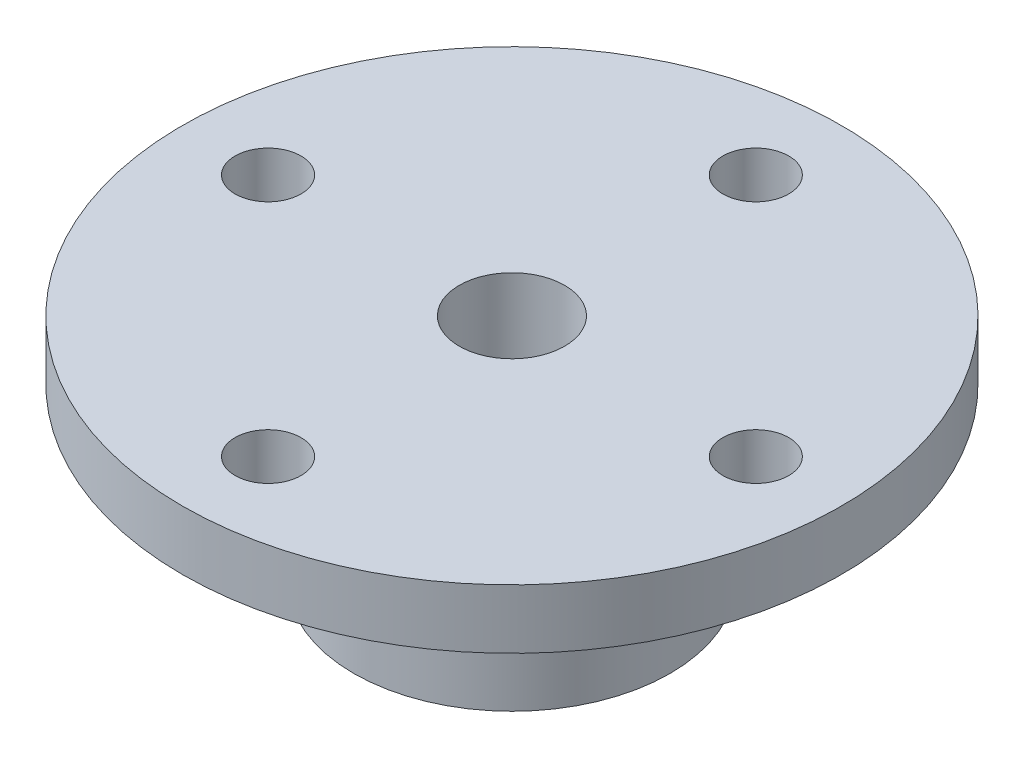
ISO-10303-21;
HEADER;
FILE_DESCRIPTION(('STEP AP214'),'2;1');
FILE_NAME('part.step','',(''),(''),'','','');
FILE_SCHEMA(('AUTOMOTIVE_DESIGN { 1 0 10303 214 1 1 1 1 }'));
ENDSEC;
DATA;
#1=APPLICATION_CONTEXT('core data for automotive mechanical design processes');
#2=APPLICATION_PROTOCOL_DEFINITION('international standard','automotive_design',2000,#1);
#3=PRODUCT_CONTEXT('',#1,'mechanical');
#4=PRODUCT('Part','Part','',(#3));
#5=PRODUCT_RELATED_PRODUCT_CATEGORY('part','',(#4));
#6=PRODUCT_DEFINITION_FORMATION('','',#4);
#7=PRODUCT_DEFINITION_CONTEXT('part definition',#1,'design');
#8=PRODUCT_DEFINITION('design','',#6,#7);
#9=PRODUCT_DEFINITION_SHAPE('','',#8);
#10=(LENGTH_UNIT() NAMED_UNIT(*) SI_UNIT(.MILLI.,.METRE.));
#11=(NAMED_UNIT(*) PLANE_ANGLE_UNIT() SI_UNIT($,.RADIAN.));
#12=(NAMED_UNIT(*) SI_UNIT($,.STERADIAN.) SOLID_ANGLE_UNIT());
#13=UNCERTAINTY_MEASURE_WITH_UNIT(LENGTH_MEASURE(1.E-05),#10,'distance_accuracy_value','');
#14=(GEOMETRIC_REPRESENTATION_CONTEXT(3) GLOBAL_UNCERTAINTY_ASSIGNED_CONTEXT((#13)) GLOBAL_UNIT_ASSIGNED_CONTEXT((#10,
#11,#12)) REPRESENTATION_CONTEXT('',''));
#15=CARTESIAN_POINT('',(0.,0.,0.));
#16=DIRECTION('',(0.,0.,1.));
#17=DIRECTION('',(1.,0.,0.));
#18=AXIS2_PLACEMENT_3D('',#15,#16,#17);
#19=CARTESIAN_POINT('',(0.,0.,0.));
#20=DIRECTION('',(0.,1.,0.));
#21=DIRECTION('',(0.,0.,1.));
#22=AXIS2_PLACEMENT_3D('',#19,#20,#21);
#23=PLANE('',#22);
#24=CARTESIAN_POINT('',(0.,0.,0.));
#25=DIRECTION('',(0.,1.,0.));
#26=DIRECTION('',(0.,0.,1.));
#27=AXIS2_PLACEMENT_3D('',#24,#25,#26);
#28=CIRCLE('',#27,12.);
#29=CARTESIAN_POINT('',(0.,0.,-12.));
#30=VERTEX_POINT('',#29);
#31=EDGE_CURVE('E44',#30,#30,#28,.T.);
#32=ORIENTED_EDGE('',*,*,#31,.F.);
#33=EDGE_LOOP('',(#32));
#34=FACE_BOUND('',#33,.T.);
#35=CARTESIAN_POINT('',(0.,0.,0.));
#36=DIRECTION('',(0.,1.,0.));
#37=DIRECTION('',(0.,0.,1.));
#38=AXIS2_PLACEMENT_3D('',#35,#36,#37);
#39=CIRCLE('',#38,4.);
#40=CARTESIAN_POINT('',(0.,0.,-4.));
#41=VERTEX_POINT('',#40);
#42=EDGE_CURVE('E51',#41,#41,#39,.T.);
#43=ORIENTED_EDGE('',*,*,#42,.T.);
#44=EDGE_LOOP('',(#43));
#45=FACE_BOUND('',#44,.T.);
#46=ADVANCED_FACE('F40',(#34,#45),#23,.F.);
#47=CARTESIAN_POINT('',(0.,13.,0.));
#48=DIRECTION('',(0.,-1.,0.));
#49=DIRECTION('',(0.,0.,-1.));
#50=AXIS2_PLACEMENT_3D('',#47,#48,#49);
#51=CYLINDRICAL_SURFACE('',#50,12.);
#52=CARTESIAN_POINT('',(0.,13.,0.));
#53=DIRECTION('',(0.,1.,0.));
#54=DIRECTION('',(0.,0.,1.));
#55=AXIS2_PLACEMENT_3D('',#52,#53,#54);
#56=CIRCLE('',#55,12.);
#57=CARTESIAN_POINT('',(0.,13.,-12.));
#58=VERTEX_POINT('',#57);
#59=EDGE_CURVE('E10',#58,#58,#56,.T.);
#60=CARTESIAN_POINT('',(0.,13.,-12.));
#61=CARTESIAN_POINT('',(0.,12.8645833333333,-12.));
#62=CARTESIAN_POINT('',(0.,12.7291666666667,-12.));
#63=CARTESIAN_POINT('',(0.,12.4583333333333,-12.));
#64=CARTESIAN_POINT('',(0.,12.3229166666667,-12.));
#65=CARTESIAN_POINT('',(0.,12.0520833333333,-12.));
#66=CARTESIAN_POINT('',(0.,11.9166666666667,-12.));
#67=CARTESIAN_POINT('',(0.,11.6458333333333,-12.));
#68=CARTESIAN_POINT('',(0.,11.5104166666667,-12.));
#69=CARTESIAN_POINT('',(0.,11.2395833333333,-12.));
#70=CARTESIAN_POINT('',(0.,11.1041666666667,-12.));
#71=CARTESIAN_POINT('',(0.,10.8333333333333,-12.));
#72=CARTESIAN_POINT('',(0.,10.6979166666667,-12.));
#73=CARTESIAN_POINT('',(0.,10.4270833333333,-12.));
#74=CARTESIAN_POINT('',(0.,10.2916666666667,-12.));
#75=CARTESIAN_POINT('',(0.,10.0208333333333,-12.));
#76=CARTESIAN_POINT('',(0.,9.88541666666667,-12.));
#77=CARTESIAN_POINT('',(0.,9.61458333333333,-12.));
#78=CARTESIAN_POINT('',(0.,9.47916666666667,-12.));
#79=CARTESIAN_POINT('',(0.,9.20833333333333,-12.));
#80=CARTESIAN_POINT('',(0.,9.07291666666666,-12.));
#81=CARTESIAN_POINT('',(0.,8.80208333333333,-12.));
#82=CARTESIAN_POINT('',(0.,8.66666666666667,-12.));
#83=CARTESIAN_POINT('',(0.,8.39583333333333,-12.));
#84=CARTESIAN_POINT('',(0.,8.26041666666667,-12.));
#85=CARTESIAN_POINT('',(0.,7.98958333333333,-12.));
#86=CARTESIAN_POINT('',(0.,7.85416666666667,-12.));
#87=CARTESIAN_POINT('',(0.,7.58333333333333,-12.));
#88=CARTESIAN_POINT('',(0.,7.44791666666667,-12.));
#89=CARTESIAN_POINT('',(0.,7.17708333333333,-12.));
#90=CARTESIAN_POINT('',(0.,7.04166666666667,-12.));
#91=CARTESIAN_POINT('',(0.,6.77083333333333,-12.));
#92=CARTESIAN_POINT('',(0.,6.63541666666667,-12.));
#93=CARTESIAN_POINT('',(0.,6.36458333333333,-12.));
#94=CARTESIAN_POINT('',(0.,6.22916666666667,-12.));
#95=CARTESIAN_POINT('',(0.,5.95833333333333,-12.));
#96=CARTESIAN_POINT('',(0.,5.82291666666667,-12.));
#97=CARTESIAN_POINT('',(0.,5.55208333333333,-12.));
#98=CARTESIAN_POINT('',(0.,5.41666666666667,-12.));
#99=CARTESIAN_POINT('',(0.,5.14583333333333,-12.));
#100=CARTESIAN_POINT('',(0.,5.01041666666667,-12.));
#101=CARTESIAN_POINT('',(0.,4.73958333333333,-12.));
#102=CARTESIAN_POINT('',(0.,4.60416666666667,-12.));
#103=CARTESIAN_POINT('',(0.,4.33333333333333,-12.));
#104=CARTESIAN_POINT('',(0.,4.19791666666667,-12.));
#105=CARTESIAN_POINT('',(0.,3.92708333333333,-12.));
#106=CARTESIAN_POINT('',(0.,3.79166666666667,-12.));
#107=CARTESIAN_POINT('',(0.,3.52083333333333,-12.));
#108=CARTESIAN_POINT('',(0.,3.38541666666667,-12.));
#109=CARTESIAN_POINT('',(0.,3.11458333333333,-12.));
#110=CARTESIAN_POINT('',(0.,2.97916666666667,-12.));
#111=CARTESIAN_POINT('',(0.,2.70833333333333,-12.));
#112=CARTESIAN_POINT('',(0.,2.57291666666667,-12.));
#113=CARTESIAN_POINT('',(0.,2.30208333333333,-12.));
#114=CARTESIAN_POINT('',(0.,2.16666666666667,-12.));
#115=CARTESIAN_POINT('',(0.,1.89583333333333,-12.));
#116=CARTESIAN_POINT('',(0.,1.76041666666667,-12.));
#117=CARTESIAN_POINT('',(0.,1.48958333333333,-12.));
#118=CARTESIAN_POINT('',(0.,1.35416666666667,-12.));
#119=CARTESIAN_POINT('',(0.,1.08333333333333,-12.));
#120=CARTESIAN_POINT('',(0.,0.947916666666667,-12.));
#121=CARTESIAN_POINT('',(0.,0.677083333333334,-12.));
#122=CARTESIAN_POINT('',(0.,0.541666666666667,-12.));
#123=CARTESIAN_POINT('',(0.,0.270833333333334,-12.));
#124=CARTESIAN_POINT('',(0.,0.135416666666667,-12.));
#125=CARTESIAN_POINT('',(0.,0.,-12.));
#126=B_SPLINE_CURVE_WITH_KNOTS('',3,(#60,#61,#62,#63,#64,#65,#66,#67,#68,#69,#70,#71,#72,#73,
#74,#75,#76,#77,#78,#79,#80,#81,#82,#83,#84,#85,#86,#87,#88,#89,#90,#91,#92,#93,#94,#95,#96,#97,
#98,#99,#100,#101,#102,#103,#104,#105,#106,#107,#108,#109,#110,#111,#112,#113,#114,#115,#116,
#117,#118,#119,#120,#121,#122,#123,#124,#125),.UNSPECIFIED.,.F.,.F.,(4,2,2,2,2,2,2,2,2,2,2,2,2,
2,2,2,2,2,2,2,2,2,2,2,2,2,2,2,2,2,2,2,4),(0.,0.40625,0.812500000000001,1.21875,1.625,2.03125,
2.4375,2.84375,3.25,3.65625,4.0625,4.46875,4.875,5.28125,5.6875,6.09375,6.5,6.90625,7.3125,
7.71875,8.125,8.53125,8.9375,9.34375,9.75,10.15625,10.5625,10.96875,11.375,11.78125,12.1875,
12.59375,13.),.UNSPECIFIED.);
#127=EDGE_CURVE('BSEAM42',#58,#30,#126,.T.);
#128=ORIENTED_EDGE('',*,*,#59,.F.);
#129=ORIENTED_EDGE('',*,*,#31,.T.);
#130=ORIENTED_EDGE('',*,*,#127,.T.);
#131=ORIENTED_EDGE('',*,*,#127,.F.);
#132=EDGE_LOOP('',(#128,#130,#129,#131));
#133=FACE_BOUND('',#132,.T.);
#134=ADVANCED_FACE('F42',(#133),#51,.T.);
#135=CARTESIAN_POINT('',(0.,13.,0.));
#136=DIRECTION('',(0.,-1.,0.));
#137=DIRECTION('',(0.,0.,-1.));
#138=AXIS2_PLACEMENT_3D('',#135,#136,#137);
#139=CYLINDRICAL_SURFACE('',#138,4.);
#140=CARTESIAN_POINT('',(0.,17.5,0.));
#141=DIRECTION('',(0.,1.,0.));
#142=DIRECTION('',(0.,0.,1.));
#143=AXIS2_PLACEMENT_3D('',#140,#141,#142);
#144=CIRCLE('',#143,4.);
#145=CARTESIAN_POINT('',(0.,17.5,-4.));
#146=VERTEX_POINT('',#145);
#147=EDGE_CURVE('E55',#146,#146,#144,.F.);
#148=CARTESIAN_POINT('',(0.,0.,-4.));
#149=CARTESIAN_POINT('',(0.,0.182291666666667,-4.));
#150=CARTESIAN_POINT('',(0.,0.364583333333334,-4.));
#151=CARTESIAN_POINT('',(0.,0.729166666666667,-4.));
#152=CARTESIAN_POINT('',(0.,0.911458333333334,-4.));
#153=CARTESIAN_POINT('',(0.,1.27604166666667,-4.));
#154=CARTESIAN_POINT('',(0.,1.45833333333333,-4.));
#155=CARTESIAN_POINT('',(0.,1.82291666666667,-4.));
#156=CARTESIAN_POINT('',(0.,2.00520833333333,-4.));
#157=CARTESIAN_POINT('',(0.,2.36979166666667,-4.));
#158=CARTESIAN_POINT('',(0.,2.55208333333333,-4.));
#159=CARTESIAN_POINT('',(0.,2.91666666666667,-4.));
#160=CARTESIAN_POINT('',(0.,3.09895833333333,-4.));
#161=CARTESIAN_POINT('',(0.,3.46354166666667,-4.));
#162=CARTESIAN_POINT('',(0.,3.64583333333333,-4.));
#163=CARTESIAN_POINT('',(0.,4.01041666666667,-4.));
#164=CARTESIAN_POINT('',(0.,4.19270833333333,-4.));
#165=CARTESIAN_POINT('',(0.,4.55729166666667,-4.));
#166=CARTESIAN_POINT('',(0.,4.73958333333333,-4.));
#167=CARTESIAN_POINT('',(0.,5.10416666666667,-4.));
#168=CARTESIAN_POINT('',(0.,5.28645833333333,-4.));
#169=CARTESIAN_POINT('',(0.,5.65104166666667,-4.));
#170=CARTESIAN_POINT('',(0.,5.83333333333333,-4.));
#171=CARTESIAN_POINT('',(0.,6.19791666666667,-4.));
#172=CARTESIAN_POINT('',(0.,6.38020833333333,-4.));
#173=CARTESIAN_POINT('',(0.,6.74479166666667,-4.));
#174=CARTESIAN_POINT('',(0.,6.92708333333333,-4.));
#175=CARTESIAN_POINT('',(0.,7.29166666666667,-4.));
#176=CARTESIAN_POINT('',(0.,7.47395833333333,-4.));
#177=CARTESIAN_POINT('',(0.,7.83854166666667,-4.));
#178=CARTESIAN_POINT('',(0.,8.02083333333333,-4.));
#179=CARTESIAN_POINT('',(0.,8.38541666666667,-4.));
#180=CARTESIAN_POINT('',(0.,8.56770833333333,-4.));
#181=CARTESIAN_POINT('',(0.,8.93229166666667,-4.));
#182=CARTESIAN_POINT('',(0.,9.11458333333333,-4.));
#183=CARTESIAN_POINT('',(0.,9.47916666666667,-4.));
#184=CARTESIAN_POINT('',(0.,9.66145833333333,-4.));
#185=CARTESIAN_POINT('',(0.,10.0260416666667,-4.));
#186=CARTESIAN_POINT('',(0.,10.2083333333333,-4.));
#187=CARTESIAN_POINT('',(0.,10.5729166666667,-4.));
#188=CARTESIAN_POINT('',(0.,10.7552083333333,-4.));
#189=CARTESIAN_POINT('',(0.,11.1197916666667,-4.));
#190=CARTESIAN_POINT('',(0.,11.3020833333333,-4.));
#191=CARTESIAN_POINT('',(0.,11.6666666666667,-4.));
#192=CARTESIAN_POINT('',(0.,11.8489583333333,-4.));
#193=CARTESIAN_POINT('',(0.,12.2135416666667,-4.));
#194=CARTESIAN_POINT('',(0.,12.3958333333333,-4.));
#195=CARTESIAN_POINT('',(0.,12.7604166666667,-4.));
#196=CARTESIAN_POINT('',(0.,12.9427083333333,-4.));
#197=CARTESIAN_POINT('',(0.,13.3072916666667,-4.));
#198=CARTESIAN_POINT('',(0.,13.4895833333333,-4.));
#199=CARTESIAN_POINT('',(0.,13.8541666666667,-4.));
#200=CARTESIAN_POINT('',(0.,14.0364583333333,-4.));
#201=CARTESIAN_POINT('',(0.,14.4010416666667,-4.));
#202=CARTESIAN_POINT('',(0.,14.5833333333333,-4.));
#203=CARTESIAN_POINT('',(0.,14.9479166666667,-4.));
#204=CARTESIAN_POINT('',(0.,15.1302083333333,-4.));
#205=CARTESIAN_POINT('',(0.,15.4947916666667,-4.));
#206=CARTESIAN_POINT('',(0.,15.6770833333333,-4.));
#207=CARTESIAN_POINT('',(0.,16.0416666666667,-4.));
#208=CARTESIAN_POINT('',(0.,16.2239583333333,-4.));
#209=CARTESIAN_POINT('',(0.,16.5885416666667,-4.));
#210=CARTESIAN_POINT('',(0.,16.7708333333333,-4.));
#211=CARTESIAN_POINT('',(0.,17.1354166666667,-4.));
#212=CARTESIAN_POINT('',(0.,17.3177083333333,-4.));
#213=CARTESIAN_POINT('',(0.,17.5,-4.));
#214=B_SPLINE_CURVE_WITH_KNOTS('',3,(#148,#149,#150,#151,#152,#153,#154,#155,#156,#157,#158,
#159,#160,#161,#162,#163,#164,#165,#166,#167,#168,#169,#170,#171,#172,#173,#174,#175,#176,#177,
#178,#179,#180,#181,#182,#183,#184,#185,#186,#187,#188,#189,#190,#191,#192,#193,#194,#195,#196,
#197,#198,#199,#200,#201,#202,#203,#204,#205,#206,#207,#208,#209,#210,#211,#212,#213),
.UNSPECIFIED.,.F.,.F.,(4,2,2,2,2,2,2,2,2,2,2,2,2,2,2,2,2,2,2,2,2,2,2,2,2,2,2,2,2,2,2,2,4),(0.,
0.546875,1.09375,1.640625,2.1875,2.734375,3.28125,3.828125,4.375,4.921875,5.46875,6.015625,
6.5625,7.109375,7.65625,8.203125,8.75,9.296875,9.84375,10.390625,10.9375,11.484375,12.03125,
12.578125,13.125,13.671875,14.21875,14.765625,15.3125,15.859375,16.40625,16.953125,17.5),.UNSPECIFIED.);
#215=EDGE_CURVE('BSEAM107',#41,#146,#214,.T.);
#216=ORIENTED_EDGE('',*,*,#42,.F.);
#217=ORIENTED_EDGE('',*,*,#147,.F.);
#218=ORIENTED_EDGE('',*,*,#215,.T.);
#219=ORIENTED_EDGE('',*,*,#215,.F.);
#220=EDGE_LOOP('',(#216,#218,#217,#219));
#221=FACE_BOUND('',#220,.T.);
#222=ADVANCED_FACE('F107',(#221),#139,.F.);
#223=CARTESIAN_POINT('',(0.,17.5,0.));
#224=DIRECTION('',(0.,-1.,0.));
#225=DIRECTION('',(0.,0.,-1.));
#226=AXIS2_PLACEMENT_3D('',#223,#224,#225);
#227=CYLINDRICAL_SURFACE('',#226,25.);
#228=CARTESIAN_POINT('',(0.,17.5,0.));
#229=DIRECTION('',(0.,1.,0.));
#230=DIRECTION('',(0.,0.,1.));
#231=AXIS2_PLACEMENT_3D('',#228,#229,#230);
#232=CIRCLE('',#231,25.);
#233=CARTESIAN_POINT('',(0.,17.5,25.));
#234=VERTEX_POINT('',#233);
#235=EDGE_CURVE('E74',#234,#234,#232,.T.);
#236=ORIENTED_EDGE('',*,*,#235,.F.);
#237=EDGE_LOOP('',(#236));
#238=FACE_BOUND('',#237,.T.);
#239=CARTESIAN_POINT('',(0.,13.,0.));
#240=DIRECTION('',(0.,1.,0.));
#241=DIRECTION('',(0.,0.,1.));
#242=AXIS2_PLACEMENT_3D('',#239,#240,#241);
#243=CIRCLE('',#242,25.);
#244=CARTESIAN_POINT('',(0.,13.,25.));
#245=VERTEX_POINT('',#244);
#246=EDGE_CURVE('E56',#245,#245,#243,.T.);
#247=ORIENTED_EDGE('',*,*,#246,.T.);
#248=EDGE_LOOP('',(#247));
#249=FACE_BOUND('',#248,.T.);
#250=ADVANCED_FACE('F109',(#238,#249),#227,.T.);
#251=CARTESIAN_POINT('',(18.5,17.5,0.));
#252=DIRECTION('',(0.,-1.,0.));
#253=DIRECTION('',(0.,0.,-1.));
#254=AXIS2_PLACEMENT_3D('',#251,#252,#253);
#255=CYLINDRICAL_SURFACE('',#254,2.5);
#256=CARTESIAN_POINT('',(18.5,17.5,0.));
#257=DIRECTION('',(0.,1.,0.));
#258=DIRECTION('',(0.,0.,1.));
#259=AXIS2_PLACEMENT_3D('',#256,#257,#258);
#260=CIRCLE('',#259,2.5);
#261=CARTESIAN_POINT('',(18.5,17.5,2.5));
#262=VERTEX_POINT('',#261);
#263=EDGE_CURVE('E77',#262,#262,#260,.T.);
#264=ORIENTED_EDGE('',*,*,#263,.T.);
#265=EDGE_LOOP('',(#264));
#266=FACE_BOUND('',#265,.T.);
#267=CARTESIAN_POINT('',(18.5,13.,0.));
#268=DIRECTION('',(0.,1.,0.));
#269=DIRECTION('',(0.,0.,1.));
#270=AXIS2_PLACEMENT_3D('',#267,#268,#269);
#271=CIRCLE('',#270,2.5);
#272=CARTESIAN_POINT('',(18.5,13.,2.5));
#273=VERTEX_POINT('',#272);
#274=EDGE_CURVE('E60',#273,#273,#271,.T.);
#275=ORIENTED_EDGE('',*,*,#274,.F.);
#276=EDGE_LOOP('',(#275));
#277=FACE_BOUND('',#276,.T.);
#278=ADVANCED_FACE('F116',(#266,#277),#255,.F.);
#279=CARTESIAN_POINT('',(0.,17.5,-18.5));
#280=DIRECTION('',(0.,-1.,0.));
#281=DIRECTION('',(0.,0.,-1.));
#282=AXIS2_PLACEMENT_3D('',#279,#280,#281);
#283=CYLINDRICAL_SURFACE('',#282,2.5);
#284=CARTESIAN_POINT('',(0.,17.5,-18.5));
#285=DIRECTION('',(0.,1.,0.));
#286=DIRECTION('',(0.,0.,1.));
#287=AXIS2_PLACEMENT_3D('',#284,#285,#286);
#288=CIRCLE('',#287,2.5);
#289=CARTESIAN_POINT('',(0.,17.5,-16.));
#290=VERTEX_POINT('',#289);
#291=EDGE_CURVE('E80',#290,#290,#288,.T.);
#292=ORIENTED_EDGE('',*,*,#291,.T.);
#293=EDGE_LOOP('',(#292));
#294=FACE_BOUND('',#293,.T.);
#295=CARTESIAN_POINT('',(0.,13.,-18.5));
#296=DIRECTION('',(0.,1.,0.));
#297=DIRECTION('',(0.,0.,1.));
#298=AXIS2_PLACEMENT_3D('',#295,#296,#297);
#299=CIRCLE('',#298,2.5);
#300=CARTESIAN_POINT('',(0.,13.,-16.));
#301=VERTEX_POINT('',#300);
#302=EDGE_CURVE('E63',#301,#301,#299,.T.);
#303=ORIENTED_EDGE('',*,*,#302,.F.);
#304=EDGE_LOOP('',(#303));
#305=FACE_BOUND('',#304,.T.);
#306=ADVANCED_FACE('F160',(#294,#305),#283,.F.);
#307=CARTESIAN_POINT('',(-18.5,17.5,0.));
#308=DIRECTION('',(0.,-1.,0.));
#309=DIRECTION('',(0.,0.,-1.));
#310=AXIS2_PLACEMENT_3D('',#307,#308,#309);
#311=CYLINDRICAL_SURFACE('',#310,2.5);
#312=CARTESIAN_POINT('',(-18.5,17.5,0.));
#313=DIRECTION('',(0.,1.,0.));
#314=DIRECTION('',(0.,0.,1.));
#315=AXIS2_PLACEMENT_3D('',#312,#313,#314);
#316=CIRCLE('',#315,2.5);
#317=CARTESIAN_POINT('',(-18.5,17.5,2.5));
#318=VERTEX_POINT('',#317);
#319=EDGE_CURVE('E83',#318,#318,#316,.T.);
#320=ORIENTED_EDGE('',*,*,#319,.T.);
#321=EDGE_LOOP('',(#320));
#322=FACE_BOUND('',#321,.T.);
#323=CARTESIAN_POINT('',(-18.5,13.,0.));
#324=DIRECTION('',(0.,1.,0.));
#325=DIRECTION('',(0.,0.,1.));
#326=AXIS2_PLACEMENT_3D('',#323,#324,#325);
#327=CIRCLE('',#326,2.5);
#328=CARTESIAN_POINT('',(-18.5,13.,2.5));
#329=VERTEX_POINT('',#328);
#330=EDGE_CURVE('E66',#329,#329,#327,.T.);
#331=ORIENTED_EDGE('',*,*,#330,.F.);
#332=EDGE_LOOP('',(#331));
#333=FACE_BOUND('',#332,.T.);
#334=ADVANCED_FACE('F170',(#322,#333),#311,.F.);
#335=CARTESIAN_POINT('',(0.,17.5,18.5));
#336=DIRECTION('',(0.,-1.,0.));
#337=DIRECTION('',(0.,0.,-1.));
#338=AXIS2_PLACEMENT_3D('',#335,#336,#337);
#339=CYLINDRICAL_SURFACE('',#338,2.5);
#340=CARTESIAN_POINT('',(0.,17.5,18.5));
#341=DIRECTION('',(0.,1.,0.));
#342=DIRECTION('',(0.,0.,1.));
#343=AXIS2_PLACEMENT_3D('',#340,#341,#342);
#344=CIRCLE('',#343,2.5);
#345=CARTESIAN_POINT('',(0.,17.5,21.));
#346=VERTEX_POINT('',#345);
#347=EDGE_CURVE('E59',#346,#346,#344,.T.);
#348=ORIENTED_EDGE('',*,*,#347,.T.);
#349=EDGE_LOOP('',(#348));
#350=FACE_BOUND('',#349,.T.);
#351=CARTESIAN_POINT('',(0.,13.,18.5));
#352=DIRECTION('',(0.,1.,0.));
#353=DIRECTION('',(0.,0.,1.));
#354=AXIS2_PLACEMENT_3D('',#351,#352,#353);
#355=CIRCLE('',#354,2.5);
#356=CARTESIAN_POINT('',(0.,13.,21.));
#357=VERTEX_POINT('',#356);
#358=EDGE_CURVE('E69',#357,#357,#355,.T.);
#359=ORIENTED_EDGE('',*,*,#358,.F.);
#360=EDGE_LOOP('',(#359));
#361=FACE_BOUND('',#360,.T.);
#362=ADVANCED_FACE('F89',(#350,#361),#339,.F.);
#363=CARTESIAN_POINT('',(0.,17.5,0.));
#364=DIRECTION('',(0.,1.,0.));
#365=DIRECTION('',(0.,0.,1.));
#366=AXIS2_PLACEMENT_3D('',#363,#364,#365);
#367=PLANE('',#366);
#368=ORIENTED_EDGE('',*,*,#347,.F.);
#369=EDGE_LOOP('',(#368));
#370=FACE_BOUND('',#369,.T.);
#371=ORIENTED_EDGE('',*,*,#319,.F.);
#372=EDGE_LOOP('',(#371));
#373=FACE_BOUND('',#372,.T.);
#374=ORIENTED_EDGE('',*,*,#291,.F.);
#375=EDGE_LOOP('',(#374));
#376=FACE_BOUND('',#375,.T.);
#377=ORIENTED_EDGE('',*,*,#263,.F.);
#378=EDGE_LOOP('',(#377));
#379=FACE_BOUND('',#378,.T.);
#380=ORIENTED_EDGE('',*,*,#235,.T.);
#381=EDGE_LOOP('',(#380));
#382=FACE_BOUND('',#381,.T.);
#383=ORIENTED_EDGE('',*,*,#147,.T.);
#384=EDGE_LOOP('',(#383));
#385=FACE_BOUND('',#384,.T.);
#386=ADVANCED_FACE('F92',(#370,#373,#376,#379,#382,#385),#367,.T.);
#387=CARTESIAN_POINT('',(0.,13.,0.));
#388=DIRECTION('',(0.,1.,0.));
#389=DIRECTION('',(0.,0.,1.));
#390=AXIS2_PLACEMENT_3D('',#387,#388,#389);
#391=PLANE('',#390);
#392=ORIENTED_EDGE('',*,*,#59,.T.);
#393=EDGE_LOOP('',(#392));
#394=FACE_BOUND('',#393,.T.);
#395=ORIENTED_EDGE('',*,*,#358,.T.);
#396=EDGE_LOOP('',(#395));
#397=FACE_BOUND('',#396,.T.);
#398=ORIENTED_EDGE('',*,*,#330,.T.);
#399=EDGE_LOOP('',(#398));
#400=FACE_BOUND('',#399,.T.);
#401=ORIENTED_EDGE('',*,*,#302,.T.);
#402=EDGE_LOOP('',(#401));
#403=FACE_BOUND('',#402,.T.);
#404=ORIENTED_EDGE('',*,*,#274,.T.);
#405=EDGE_LOOP('',(#404));
#406=FACE_BOUND('',#405,.T.);
#407=ORIENTED_EDGE('',*,*,#246,.F.);
#408=EDGE_LOOP('',(#407));
#409=FACE_BOUND('',#408,.T.);
#410=ADVANCED_FACE('F95',(#394,#397,#400,#403,#406,#409),#391,.F.);
#411=CLOSED_SHELL('',(#46,#134,#222,#250,#278,#306,#334,#362,#386,#410));
#412=MANIFOLD_SOLID_BREP('B2',#411);
#413=ADVANCED_BREP_SHAPE_REPRESENTATION('',(#18,#412),#14);
#414=SHAPE_DEFINITION_REPRESENTATION(#9,#413);
ENDSEC;
END-ISO-10303-21;
